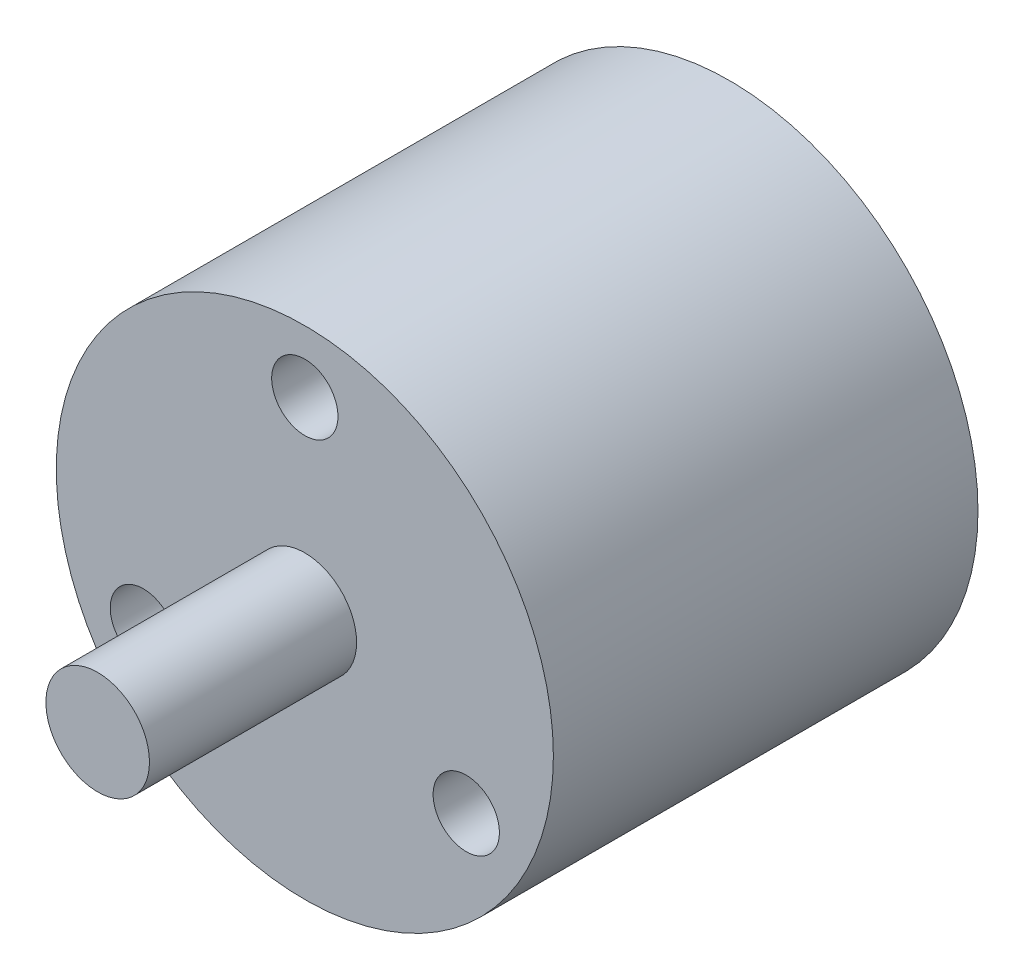
ISO-10303-21;
HEADER;
FILE_DESCRIPTION(('STEP AP214'),'2;1');
FILE_NAME('part.step','',(''),(''),'','','');
FILE_SCHEMA(('AUTOMOTIVE_DESIGN { 1 0 10303 214 1 1 1 1 }'));
ENDSEC;
DATA;
#1=APPLICATION_CONTEXT('core data for automotive mechanical design processes');
#2=APPLICATION_PROTOCOL_DEFINITION('international standard','automotive_design',2000,#1);
#3=PRODUCT_CONTEXT('',#1,'mechanical');
#4=PRODUCT('Part','Part','',(#3));
#5=PRODUCT_RELATED_PRODUCT_CATEGORY('part','',(#4));
#6=PRODUCT_DEFINITION_FORMATION('','',#4);
#7=PRODUCT_DEFINITION_CONTEXT('part definition',#1,'design');
#8=PRODUCT_DEFINITION('design','',#6,#7);
#9=PRODUCT_DEFINITION_SHAPE('','',#8);
#10=(LENGTH_UNIT() NAMED_UNIT(*) SI_UNIT(.MILLI.,.METRE.));
#11=(NAMED_UNIT(*) PLANE_ANGLE_UNIT() SI_UNIT($,.RADIAN.));
#12=(NAMED_UNIT(*) SI_UNIT($,.STERADIAN.) SOLID_ANGLE_UNIT());
#13=UNCERTAINTY_MEASURE_WITH_UNIT(LENGTH_MEASURE(1.E-05),#10,'distance_accuracy_value','');
#14=(GEOMETRIC_REPRESENTATION_CONTEXT(3) GLOBAL_UNCERTAINTY_ASSIGNED_CONTEXT((#13)) GLOBAL_UNIT_ASSIGNED_CONTEXT((#10,
#11,#12)) REPRESENTATION_CONTEXT('',''));
#15=CARTESIAN_POINT('',(0.,0.,0.));
#16=DIRECTION('',(0.,0.,1.));
#17=DIRECTION('',(1.,0.,0.));
#18=AXIS2_PLACEMENT_3D('',#15,#16,#17);
#19=CARTESIAN_POINT('',(0.,0.,20.5));
#20=DIRECTION('',(0.,0.,-1.));
#21=DIRECTION('',(-1.,0.,0.));
#22=AXIS2_PLACEMENT_3D('',#19,#20,#21);
#23=CYLINDRICAL_SURFACE('',#22,12.);
#24=CARTESIAN_POINT('',(0.,0.,20.5));
#25=DIRECTION('',(0.,0.,1.));
#26=DIRECTION('',(1.,0.,0.));
#27=AXIS2_PLACEMENT_3D('',#24,#25,#26);
#28=CIRCLE('',#27,12.);
#29=CARTESIAN_POINT('',(12.,0.,20.5));
#30=VERTEX_POINT('',#29);
#31=EDGE_CURVE('E42',#30,#30,#28,.T.);
#32=ORIENTED_EDGE('',*,*,#31,.F.);
#33=EDGE_LOOP('',(#32));
#34=FACE_BOUND('',#33,.T.);
#35=CARTESIAN_POINT('',(0.,0.,0.));
#36=DIRECTION('',(0.,0.,1.));
#37=DIRECTION('',(1.,0.,0.));
#38=AXIS2_PLACEMENT_3D('',#35,#36,#37);
#39=CIRCLE('',#38,12.);
#40=CARTESIAN_POINT('',(12.,0.,0.));
#41=VERTEX_POINT('',#40);
#42=EDGE_CURVE('E38',#41,#41,#39,.T.);
#43=ORIENTED_EDGE('',*,*,#42,.T.);
#44=EDGE_LOOP('',(#43));
#45=FACE_BOUND('',#44,.T.);
#46=ADVANCED_FACE('F35',(#34,#45),#23,.T.);
#47=CARTESIAN_POINT('',(0.,0.,20.5));
#48=DIRECTION('',(0.,0.,1.));
#49=DIRECTION('',(1.,0.,0.));
#50=AXIS2_PLACEMENT_3D('',#47,#48,#49);
#51=PLANE('',#50);
#52=CARTESIAN_POINT('',(-7.79422863405991,-4.50000000000006,20.5));
#53=DIRECTION('',(0.,0.,1.));
#54=DIRECTION('',(1.,0.,0.));
#55=AXIS2_PLACEMENT_3D('',#52,#53,#54);
#56=CIRCLE('',#55,1.6);
#57=CARTESIAN_POINT('',(-6.19422863405991,-4.50000000000006,20.5));
#58=VERTEX_POINT('',#57);
#59=EDGE_CURVE('E61',#58,#58,#56,.T.);
#60=ORIENTED_EDGE('',*,*,#59,.F.);
#61=EDGE_LOOP('',(#60));
#62=FACE_BOUND('',#61,.T.);
#63=CARTESIAN_POINT('',(7.79422863405994,-4.50000000000001,20.5));
#64=DIRECTION('',(0.,0.,1.));
#65=DIRECTION('',(1.,0.,0.));
#66=AXIS2_PLACEMENT_3D('',#63,#64,#65);
#67=CIRCLE('',#66,1.6);
#68=CARTESIAN_POINT('',(9.39422863405994,-4.50000000000001,20.5));
#69=VERTEX_POINT('',#68);
#70=EDGE_CURVE('E55',#69,#69,#67,.T.);
#71=ORIENTED_EDGE('',*,*,#70,.F.);
#72=EDGE_LOOP('',(#71));
#73=FACE_BOUND('',#72,.T.);
#74=CARTESIAN_POINT('',(0.,9.,20.5));
#75=DIRECTION('',(0.,0.,1.));
#76=DIRECTION('',(1.,0.,0.));
#77=AXIS2_PLACEMENT_3D('',#74,#75,#76);
#78=CIRCLE('',#77,1.6);
#79=CARTESIAN_POINT('',(1.6,9.,20.5));
#80=VERTEX_POINT('',#79);
#81=EDGE_CURVE('E48',#80,#80,#78,.T.);
#82=ORIENTED_EDGE('',*,*,#81,.F.);
#83=EDGE_LOOP('',(#82));
#84=FACE_BOUND('',#83,.T.);
#85=CARTESIAN_POINT('',(0.,0.,20.5));
#86=DIRECTION('',(0.,0.,1.));
#87=DIRECTION('',(1.,0.,0.));
#88=AXIS2_PLACEMENT_3D('',#85,#86,#87);
#89=CIRCLE('',#88,2.5);
#90=CARTESIAN_POINT('',(2.5,0.,20.5));
#91=VERTEX_POINT('',#90);
#92=EDGE_CURVE('E10',#91,#91,#89,.T.);
#93=ORIENTED_EDGE('',*,*,#92,.F.);
#94=EDGE_LOOP('',(#93));
#95=FACE_BOUND('',#94,.T.);
#96=ORIENTED_EDGE('',*,*,#31,.T.);
#97=EDGE_LOOP('',(#96));
#98=FACE_BOUND('',#97,.T.);
#99=ADVANCED_FACE('F84',(#62,#73,#84,#95,#98),#51,.T.);
#100=CARTESIAN_POINT('',(0.,0.,0.));
#101=DIRECTION('',(0.,0.,1.));
#102=DIRECTION('',(1.,0.,0.));
#103=AXIS2_PLACEMENT_3D('',#100,#101,#102);
#104=PLANE('',#103);
#105=ORIENTED_EDGE('',*,*,#42,.F.);
#106=EDGE_LOOP('',(#105));
#107=FACE_BOUND('',#106,.T.);
#108=ADVANCED_FACE('F75',(#107),#104,.F.);
#109=CARTESIAN_POINT('',(0.,0.,22.5));
#110=DIRECTION('',(0.,0.,-1.));
#111=DIRECTION('',(-1.,0.,0.));
#112=AXIS2_PLACEMENT_3D('',#109,#110,#111);
#113=CYLINDRICAL_SURFACE('',#112,2.5);
#114=ORIENTED_EDGE('',*,*,#92,.T.);
#115=EDGE_LOOP('',(#114));
#116=FACE_BOUND('',#115,.T.);
#117=CARTESIAN_POINT('',(0.,0.,30.5));
#118=DIRECTION('',(0.,0.,1.));
#119=DIRECTION('',(1.,0.,0.));
#120=AXIS2_PLACEMENT_3D('',#117,#118,#119);
#121=CIRCLE('',#120,2.5);
#122=CARTESIAN_POINT('',(2.5,0.,30.5));
#123=VERTEX_POINT('',#122);
#124=EDGE_CURVE('E52',#123,#123,#121,.T.);
#125=ORIENTED_EDGE('',*,*,#124,.F.);
#126=EDGE_LOOP('',(#125));
#127=FACE_BOUND('',#126,.T.);
#128=ADVANCED_FACE('F72',(#116,#127),#113,.T.);
#129=CARTESIAN_POINT('',(0.,9.,17.5));
#130=DIRECTION('',(0.,0.,1.));
#131=DIRECTION('',(1.,0.,0.));
#132=AXIS2_PLACEMENT_3D('',#129,#130,#131);
#133=CYLINDRICAL_SURFACE('',#132,1.6);
#134=CARTESIAN_POINT('',(0.,9.,17.5));
#135=DIRECTION('',(0.,0.,1.));
#136=DIRECTION('',(1.,0.,0.));
#137=AXIS2_PLACEMENT_3D('',#134,#135,#136);
#138=CIRCLE('',#137,1.6);
#139=CARTESIAN_POINT('',(1.6,9.,17.5));
#140=VERTEX_POINT('',#139);
#141=EDGE_CURVE('E51',#140,#140,#138,.T.);
#142=ORIENTED_EDGE('',*,*,#141,.F.);
#143=EDGE_LOOP('',(#142));
#144=FACE_BOUND('',#143,.T.);
#145=ORIENTED_EDGE('',*,*,#81,.T.);
#146=EDGE_LOOP('',(#145));
#147=FACE_BOUND('',#146,.T.);
#148=ADVANCED_FACE('F74',(#144,#147),#133,.F.);
#149=CARTESIAN_POINT('',(0.,0.,17.5));
#150=DIRECTION('',(0.,0.,1.));
#151=DIRECTION('',(1.,0.,0.));
#152=AXIS2_PLACEMENT_3D('',#149,#150,#151);
#153=PLANE('',#152);
#154=ORIENTED_EDGE('',*,*,#141,.T.);
#155=EDGE_LOOP('',(#154));
#156=FACE_BOUND('',#155,.T.);
#157=ADVANCED_FACE('F81',(#156),#153,.T.);
#158=CARTESIAN_POINT('',(7.79422863405994,-4.50000000000001,17.5));
#159=DIRECTION('',(0.,0.,1.));
#160=DIRECTION('',(1.,0.,0.));
#161=AXIS2_PLACEMENT_3D('',#158,#159,#160);
#162=CYLINDRICAL_SURFACE('',#161,1.6);
#163=CARTESIAN_POINT('',(7.79422863405994,-4.50000000000001,17.5));
#164=DIRECTION('',(0.,0.,1.));
#165=DIRECTION('',(1.,0.,0.));
#166=AXIS2_PLACEMENT_3D('',#163,#164,#165);
#167=CIRCLE('',#166,1.6);
#168=CARTESIAN_POINT('',(9.39422863405994,-4.50000000000001,17.5));
#169=VERTEX_POINT('',#168);
#170=EDGE_CURVE('E58',#169,#169,#167,.T.);
#171=ORIENTED_EDGE('',*,*,#170,.F.);
#172=EDGE_LOOP('',(#171));
#173=FACE_BOUND('',#172,.T.);
#174=ORIENTED_EDGE('',*,*,#70,.T.);
#175=EDGE_LOOP('',(#174));
#176=FACE_BOUND('',#175,.T.);
#177=ADVANCED_FACE('F108',(#173,#176),#162,.F.);
#178=CARTESIAN_POINT('',(0.,0.,17.5));
#179=DIRECTION('',(0.,0.,1.));
#180=DIRECTION('',(1.,0.,0.));
#181=AXIS2_PLACEMENT_3D('',#178,#179,#180);
#182=PLANE('',#181);
#183=ORIENTED_EDGE('',*,*,#170,.T.);
#184=EDGE_LOOP('',(#183));
#185=FACE_BOUND('',#184,.T.);
#186=ADVANCED_FACE('F110',(#185),#182,.T.);
#187=CARTESIAN_POINT('',(-7.79422863405991,-4.50000000000006,17.5));
#188=DIRECTION('',(0.,0.,1.));
#189=DIRECTION('',(1.,0.,0.));
#190=AXIS2_PLACEMENT_3D('',#187,#188,#189);
#191=CYLINDRICAL_SURFACE('',#190,1.6);
#192=CARTESIAN_POINT('',(-7.79422863405991,-4.50000000000006,17.5));
#193=DIRECTION('',(0.,0.,1.));
#194=DIRECTION('',(1.,0.,0.));
#195=AXIS2_PLACEMENT_3D('',#192,#193,#194);
#196=CIRCLE('',#195,1.6);
#197=CARTESIAN_POINT('',(-6.19422863405991,-4.50000000000006,17.5));
#198=VERTEX_POINT('',#197);
#199=EDGE_CURVE('E64',#198,#198,#196,.T.);
#200=ORIENTED_EDGE('',*,*,#199,.F.);
#201=EDGE_LOOP('',(#200));
#202=FACE_BOUND('',#201,.T.);
#203=ORIENTED_EDGE('',*,*,#59,.T.);
#204=EDGE_LOOP('',(#203));
#205=FACE_BOUND('',#204,.T.);
#206=ADVANCED_FACE('F117',(#202,#205),#191,.F.);
#207=CARTESIAN_POINT('',(0.,0.,17.5));
#208=DIRECTION('',(0.,0.,1.));
#209=DIRECTION('',(1.,0.,0.));
#210=AXIS2_PLACEMENT_3D('',#207,#208,#209);
#211=PLANE('',#210);
#212=ORIENTED_EDGE('',*,*,#199,.T.);
#213=EDGE_LOOP('',(#212));
#214=FACE_BOUND('',#213,.T.);
#215=ADVANCED_FACE('F126',(#214),#211,.T.);
#216=CARTESIAN_POINT('',(0.,0.,30.5));
#217=DIRECTION('',(0.,0.,1.));
#218=DIRECTION('',(1.,0.,0.));
#219=AXIS2_PLACEMENT_3D('',#216,#217,#218);
#220=PLANE('',#219);
#221=ORIENTED_EDGE('',*,*,#124,.T.);
#222=EDGE_LOOP('',(#221));
#223=FACE_BOUND('',#222,.T.);
#224=ADVANCED_FACE('F70',(#223),#220,.T.);
#225=CLOSED_SHELL('',(#46,#99,#108,#128,#148,#157,#177,#186,#206,#215,#224));
#226=MANIFOLD_SOLID_BREP('B2',#225);
#227=ADVANCED_BREP_SHAPE_REPRESENTATION('',(#18,#226),#14);
#228=SHAPE_DEFINITION_REPRESENTATION(#9,#227);
ENDSEC;
END-ISO-10303-21;
